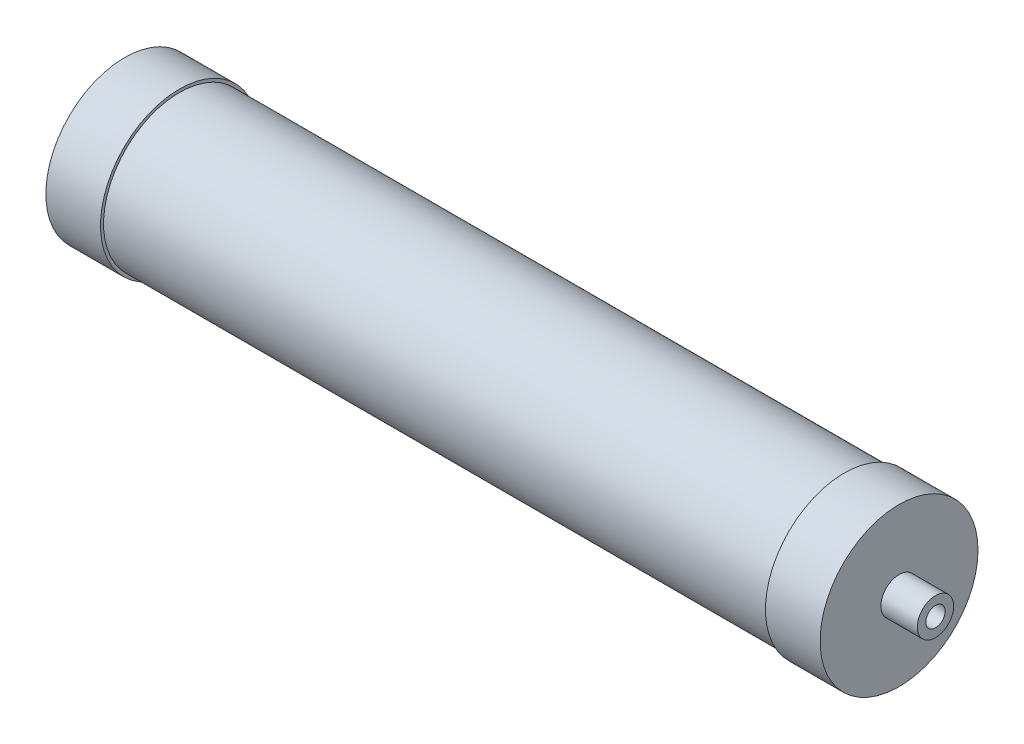
ISO-10303-21;
HEADER;
FILE_DESCRIPTION(('STEP AP214'),'2;1');
FILE_NAME('part.step','',(''),(''),'','','');
FILE_SCHEMA(('AUTOMOTIVE_DESIGN { 1 0 10303 214 1 1 1 1 }'));
ENDSEC;
DATA;
#1=APPLICATION_CONTEXT('core data for automotive mechanical design processes');
#2=APPLICATION_PROTOCOL_DEFINITION('international standard','automotive_design',2000,#1);
#3=PRODUCT_CONTEXT('',#1,'mechanical');
#4=PRODUCT('Part','Part','',(#3));
#5=PRODUCT_RELATED_PRODUCT_CATEGORY('part','',(#4));
#6=PRODUCT_DEFINITION_FORMATION('','',#4);
#7=PRODUCT_DEFINITION_CONTEXT('part definition',#1,'design');
#8=PRODUCT_DEFINITION('design','',#6,#7);
#9=PRODUCT_DEFINITION_SHAPE('','',#8);
#10=(LENGTH_UNIT() NAMED_UNIT(*) SI_UNIT(.MILLI.,.METRE.));
#11=(NAMED_UNIT(*) PLANE_ANGLE_UNIT() SI_UNIT($,.RADIAN.));
#12=(NAMED_UNIT(*) SI_UNIT($,.STERADIAN.) SOLID_ANGLE_UNIT());
#13=UNCERTAINTY_MEASURE_WITH_UNIT(LENGTH_MEASURE(1.E-05),#10,'distance_accuracy_value','');
#14=(GEOMETRIC_REPRESENTATION_CONTEXT(3) GLOBAL_UNCERTAINTY_ASSIGNED_CONTEXT((#13)) GLOBAL_UNIT_ASSIGNED_CONTEXT((#10,
#11,#12)) REPRESENTATION_CONTEXT('',''));
#15=CARTESIAN_POINT('',(0.,0.,0.));
#16=DIRECTION('',(0.,0.,1.));
#17=DIRECTION('',(1.,0.,0.));
#18=AXIS2_PLACEMENT_3D('',#15,#16,#17);
#19=CARTESIAN_POINT('',(127.5,0.,0.));
#20=DIRECTION('',(-1.,0.,0.));
#21=DIRECTION('',(0.,0.,1.));
#22=AXIS2_PLACEMENT_3D('',#19,#20,#21);
#23=CYLINDRICAL_SURFACE('',#22,25.);
#24=CARTESIAN_POINT('',(-109.5,0.,0.));
#25=DIRECTION('',(1.,0.,0.));
#26=DIRECTION('',(0.,0.,-1.));
#27=AXIS2_PLACEMENT_3D('',#24,#25,#26);
#28=CIRCLE('',#27,25.);
#29=CARTESIAN_POINT('',(-109.5,0.,-25.));
#30=VERTEX_POINT('',#29);
#31=EDGE_CURVE('E58',#30,#30,#28,.T.);
#32=ORIENTED_EDGE('',*,*,#31,.T.);
#33=EDGE_LOOP('',(#32));
#34=FACE_BOUND('',#33,.T.);
#35=CARTESIAN_POINT('',(109.5,0.,0.));
#36=DIRECTION('',(1.,0.,0.));
#37=DIRECTION('',(0.,0.,-1.));
#38=AXIS2_PLACEMENT_3D('',#35,#36,#37);
#39=CIRCLE('',#38,25.);
#40=CARTESIAN_POINT('',(109.5,0.,-25.));
#41=VERTEX_POINT('',#40);
#42=EDGE_CURVE('E49',#41,#41,#39,.T.);
#43=ORIENTED_EDGE('',*,*,#42,.F.);
#44=EDGE_LOOP('',(#43));
#45=FACE_BOUND('',#44,.T.);
#46=ADVANCED_FACE('F50',(#34,#45),#23,.T.);
#47=CARTESIAN_POINT('',(-109.5,0.,0.));
#48=DIRECTION('',(-1.,0.,0.));
#49=DIRECTION('',(0.,0.,1.));
#50=AXIS2_PLACEMENT_3D('',#47,#48,#49);
#51=CYLINDRICAL_SURFACE('',#50,26.);
#52=CARTESIAN_POINT('',(-109.5,0.,0.));
#53=DIRECTION('',(1.,0.,0.));
#54=DIRECTION('',(0.,0.,-1.));
#55=AXIS2_PLACEMENT_3D('',#52,#53,#54);
#56=CIRCLE('',#55,26.);
#57=CARTESIAN_POINT('',(-109.5,0.,-26.));
#58=VERTEX_POINT('',#57);
#59=EDGE_CURVE('E89',#58,#58,#56,.T.);
#60=ORIENTED_EDGE('',*,*,#59,.F.);
#61=EDGE_LOOP('',(#60));
#62=FACE_BOUND('',#61,.T.);
#63=CARTESIAN_POINT('',(-127.5,0.,0.));
#64=DIRECTION('',(1.,0.,0.));
#65=DIRECTION('',(0.,0.,-1.));
#66=AXIS2_PLACEMENT_3D('',#63,#64,#65);
#67=CIRCLE('',#66,26.);
#68=CARTESIAN_POINT('',(-127.5,0.,-26.));
#69=VERTEX_POINT('',#68);
#70=EDGE_CURVE('E88',#69,#69,#67,.T.);
#71=ORIENTED_EDGE('',*,*,#70,.T.);
#72=EDGE_LOOP('',(#71));
#73=FACE_BOUND('',#72,.T.);
#74=ADVANCED_FACE('F106',(#62,#73),#51,.T.);
#75=CARTESIAN_POINT('',(-109.5,0.,0.));
#76=DIRECTION('',(1.,0.,0.));
#77=DIRECTION('',(0.,0.,-1.));
#78=AXIS2_PLACEMENT_3D('',#75,#76,#77);
#79=PLANE('',#78);
#80=ORIENTED_EDGE('',*,*,#31,.F.);
#81=EDGE_LOOP('',(#80));
#82=FACE_BOUND('',#81,.T.);
#83=ORIENTED_EDGE('',*,*,#59,.T.);
#84=EDGE_LOOP('',(#83));
#85=FACE_BOUND('',#84,.T.);
#86=ADVANCED_FACE('F105',(#82,#85),#79,.T.);
#87=CARTESIAN_POINT('',(-127.5,0.,0.));
#88=DIRECTION('',(1.,0.,0.));
#89=DIRECTION('',(0.,0.,-1.));
#90=AXIS2_PLACEMENT_3D('',#87,#88,#89);
#91=PLANE('',#90);
#92=CARTESIAN_POINT('',(-127.5,0.,0.));
#93=DIRECTION('',(1.,0.,0.));
#94=DIRECTION('',(0.,0.,-1.));
#95=AXIS2_PLACEMENT_3D('',#92,#93,#94);
#96=CIRCLE('',#95,6.);
#97=CARTESIAN_POINT('',(-127.5,0.,-6.));
#98=VERTEX_POINT('',#97);
#99=EDGE_CURVE('E74',#98,#98,#96,.T.);
#100=ORIENTED_EDGE('',*,*,#99,.T.);
#101=EDGE_LOOP('',(#100));
#102=FACE_BOUND('',#101,.T.);
#103=ORIENTED_EDGE('',*,*,#70,.F.);
#104=EDGE_LOOP('',(#103));
#105=FACE_BOUND('',#104,.T.);
#106=ADVANCED_FACE('F104',(#102,#105),#91,.F.);
#107=CARTESIAN_POINT('',(127.5,0.,0.));
#108=DIRECTION('',(-1.,0.,0.));
#109=DIRECTION('',(0.,0.,1.));
#110=AXIS2_PLACEMENT_3D('',#107,#108,#109);
#111=CYLINDRICAL_SURFACE('',#110,26.);
#112=CARTESIAN_POINT('',(127.5,0.,0.));
#113=DIRECTION('',(1.,0.,0.));
#114=DIRECTION('',(0.,0.,-1.));
#115=AXIS2_PLACEMENT_3D('',#112,#113,#114);
#116=CIRCLE('',#115,26.);
#117=CARTESIAN_POINT('',(127.5,0.,-26.));
#118=VERTEX_POINT('',#117);
#119=EDGE_CURVE('E85',#118,#118,#116,.T.);
#120=ORIENTED_EDGE('',*,*,#119,.F.);
#121=EDGE_LOOP('',(#120));
#122=FACE_BOUND('',#121,.T.);
#123=CARTESIAN_POINT('',(109.5,0.,0.));
#124=DIRECTION('',(1.,0.,0.));
#125=DIRECTION('',(0.,0.,-1.));
#126=AXIS2_PLACEMENT_3D('',#123,#124,#125);
#127=CIRCLE('',#126,26.);
#128=CARTESIAN_POINT('',(109.5,0.,-26.));
#129=VERTEX_POINT('',#128);
#130=EDGE_CURVE('E79',#129,#129,#127,.T.);
#131=ORIENTED_EDGE('',*,*,#130,.T.);
#132=EDGE_LOOP('',(#131));
#133=FACE_BOUND('',#132,.T.);
#134=ADVANCED_FACE('F116',(#122,#133),#111,.T.);
#135=CARTESIAN_POINT('',(109.5,0.,0.));
#136=DIRECTION('',(1.,0.,0.));
#137=DIRECTION('',(0.,0.,-1.));
#138=AXIS2_PLACEMENT_3D('',#135,#136,#137);
#139=PLANE('',#138);
#140=ORIENTED_EDGE('',*,*,#42,.T.);
#141=EDGE_LOOP('',(#140));
#142=FACE_BOUND('',#141,.T.);
#143=ORIENTED_EDGE('',*,*,#130,.F.);
#144=EDGE_LOOP('',(#143));
#145=FACE_BOUND('',#144,.T.);
#146=ADVANCED_FACE('F123',(#142,#145),#139,.F.);
#147=CARTESIAN_POINT('',(127.5,0.,0.));
#148=DIRECTION('',(1.,0.,0.));
#149=DIRECTION('',(0.,0.,-1.));
#150=AXIS2_PLACEMENT_3D('',#147,#148,#149);
#151=PLANE('',#150);
#152=CARTESIAN_POINT('',(127.5,0.,0.));
#153=DIRECTION('',(1.,0.,0.));
#154=DIRECTION('',(0.,0.,-1.));
#155=AXIS2_PLACEMENT_3D('',#152,#153,#154);
#156=CIRCLE('',#155,6.);
#157=CARTESIAN_POINT('',(127.5,0.,-6.));
#158=VERTEX_POINT('',#157);
#159=EDGE_CURVE('E10',#158,#158,#156,.T.);
#160=ORIENTED_EDGE('',*,*,#159,.F.);
#161=EDGE_LOOP('',(#160));
#162=FACE_BOUND('',#161,.T.);
#163=ORIENTED_EDGE('',*,*,#119,.T.);
#164=EDGE_LOOP('',(#163));
#165=FACE_BOUND('',#164,.T.);
#166=ADVANCED_FACE('F147',(#162,#165),#151,.T.);
#167=CARTESIAN_POINT('',(-127.5,0.,0.));
#168=DIRECTION('',(-1.,0.,0.));
#169=DIRECTION('',(0.,0.,1.));
#170=AXIS2_PLACEMENT_3D('',#167,#168,#169);
#171=CYLINDRICAL_SURFACE('',#170,6.);
#172=ORIENTED_EDGE('',*,*,#99,.F.);
#173=EDGE_LOOP('',(#172));
#174=FACE_BOUND('',#173,.T.);
#175=CARTESIAN_POINT('',(-139.5,0.,0.));
#176=DIRECTION('',(1.,0.,0.));
#177=DIRECTION('',(0.,0.,-1.));
#178=AXIS2_PLACEMENT_3D('',#175,#176,#177);
#179=CIRCLE('',#178,6.);
#180=CARTESIAN_POINT('',(-139.5,0.,-6.));
#181=VERTEX_POINT('',#180);
#182=EDGE_CURVE('E69',#181,#181,#179,.T.);
#183=ORIENTED_EDGE('',*,*,#182,.T.);
#184=EDGE_LOOP('',(#183));
#185=FACE_BOUND('',#184,.T.);
#186=ADVANCED_FACE('F189',(#174,#185),#171,.T.);
#187=CARTESIAN_POINT('',(-139.5,0.,0.));
#188=DIRECTION('',(1.,0.,0.));
#189=DIRECTION('',(0.,0.,-1.));
#190=AXIS2_PLACEMENT_3D('',#187,#188,#189);
#191=PLANE('',#190);
#192=CARTESIAN_POINT('',(-139.5,0.,0.));
#193=DIRECTION('',(1.,0.,0.));
#194=DIRECTION('',(0.,0.,-1.));
#195=AXIS2_PLACEMENT_3D('',#192,#193,#194);
#196=CIRCLE('',#195,3.2);
#197=CARTESIAN_POINT('',(-139.5,0.,-3.2));
#198=VERTEX_POINT('',#197);
#199=EDGE_CURVE('E66',#198,#198,#196,.T.);
#200=ORIENTED_EDGE('',*,*,#199,.T.);
#201=EDGE_LOOP('',(#200));
#202=FACE_BOUND('',#201,.T.);
#203=ORIENTED_EDGE('',*,*,#182,.F.);
#204=EDGE_LOOP('',(#203));
#205=FACE_BOUND('',#204,.T.);
#206=ADVANCED_FACE('F203',(#202,#205),#191,.F.);
#207=CARTESIAN_POINT('',(-129.5,0.,0.));
#208=DIRECTION('',(-1.,0.,0.));
#209=DIRECTION('',(0.,0.,1.));
#210=AXIS2_PLACEMENT_3D('',#207,#208,#209);
#211=CYLINDRICAL_SURFACE('',#210,3.2);
#212=CARTESIAN_POINT('',(-129.5,0.,0.));
#213=DIRECTION('',(1.,0.,0.));
#214=DIRECTION('',(0.,0.,-1.));
#215=AXIS2_PLACEMENT_3D('',#212,#213,#214);
#216=CIRCLE('',#215,3.2);
#217=CARTESIAN_POINT('',(-129.5,0.,-3.2));
#218=VERTEX_POINT('',#217);
#219=EDGE_CURVE('E65',#218,#218,#216,.T.);
#220=ORIENTED_EDGE('',*,*,#219,.T.);
#221=EDGE_LOOP('',(#220));
#222=FACE_BOUND('',#221,.T.);
#223=ORIENTED_EDGE('',*,*,#199,.F.);
#224=EDGE_LOOP('',(#223));
#225=FACE_BOUND('',#224,.T.);
#226=ADVANCED_FACE('F211',(#222,#225),#211,.F.);
#227=CARTESIAN_POINT('',(-129.5,0.,0.));
#228=DIRECTION('',(1.,0.,0.));
#229=DIRECTION('',(0.,0.,-1.));
#230=AXIS2_PLACEMENT_3D('',#227,#228,#229);
#231=PLANE('',#230);
#232=ORIENTED_EDGE('',*,*,#219,.F.);
#233=EDGE_LOOP('',(#232));
#234=FACE_BOUND('',#233,.T.);
#235=ADVANCED_FACE('F222',(#234),#231,.F.);
#236=CARTESIAN_POINT('',(139.5,0.,0.));
#237=DIRECTION('',(-1.,0.,0.));
#238=DIRECTION('',(0.,0.,1.));
#239=AXIS2_PLACEMENT_3D('',#236,#237,#238);
#240=CYLINDRICAL_SURFACE('',#239,6.);
#241=CARTESIAN_POINT('',(139.5,0.,0.));
#242=DIRECTION('',(1.,0.,0.));
#243=DIRECTION('',(0.,0.,-1.));
#244=AXIS2_PLACEMENT_3D('',#241,#242,#243);
#245=CIRCLE('',#244,6.);
#246=CARTESIAN_POINT('',(139.5,0.,-6.));
#247=VERTEX_POINT('',#246);
#248=EDGE_CURVE('E64',#247,#247,#245,.T.);
#249=ORIENTED_EDGE('',*,*,#248,.F.);
#250=EDGE_LOOP('',(#249));
#251=FACE_BOUND('',#250,.T.);
#252=ORIENTED_EDGE('',*,*,#159,.T.);
#253=EDGE_LOOP('',(#252));
#254=FACE_BOUND('',#253,.T.);
#255=ADVANCED_FACE('F230',(#251,#254),#240,.T.);
#256=CARTESIAN_POINT('',(139.5,0.,0.));
#257=DIRECTION('',(1.,0.,0.));
#258=DIRECTION('',(0.,0.,-1.));
#259=AXIS2_PLACEMENT_3D('',#256,#257,#258);
#260=PLANE('',#259);
#261=CARTESIAN_POINT('',(139.5,0.,0.));
#262=DIRECTION('',(1.,0.,0.));
#263=DIRECTION('',(0.,0.,-1.));
#264=AXIS2_PLACEMENT_3D('',#261,#262,#263);
#265=CIRCLE('',#264,3.2);
#266=CARTESIAN_POINT('',(139.5,0.,-3.2));
#267=VERTEX_POINT('',#266);
#268=EDGE_CURVE('E277',#267,#267,#265,.T.);
#269=ORIENTED_EDGE('',*,*,#268,.F.);
#270=EDGE_LOOP('',(#269));
#271=FACE_BOUND('',#270,.T.);
#272=ORIENTED_EDGE('',*,*,#248,.T.);
#273=EDGE_LOOP('',(#272));
#274=FACE_BOUND('',#273,.T.);
#275=ADVANCED_FACE('F239',(#271,#274),#260,.T.);
#276=CARTESIAN_POINT('',(129.5,0.,0.));
#277=DIRECTION('',(1.,0.,0.));
#278=DIRECTION('',(0.,0.,-1.));
#279=AXIS2_PLACEMENT_3D('',#276,#277,#278);
#280=CYLINDRICAL_SURFACE('',#279,3.2);
#281=CARTESIAN_POINT('',(129.5,0.,0.));
#282=DIRECTION('',(1.,0.,0.));
#283=DIRECTION('',(0.,0.,-1.));
#284=AXIS2_PLACEMENT_3D('',#281,#282,#283);
#285=CIRCLE('',#284,3.2);
#286=CARTESIAN_POINT('',(129.5,0.,-3.2));
#287=VERTEX_POINT('',#286);
#288=EDGE_CURVE('E273',#287,#287,#285,.T.);
#289=ORIENTED_EDGE('',*,*,#288,.F.);
#290=EDGE_LOOP('',(#289));
#291=FACE_BOUND('',#290,.T.);
#292=ORIENTED_EDGE('',*,*,#268,.T.);
#293=EDGE_LOOP('',(#292));
#294=FACE_BOUND('',#293,.T.);
#295=ADVANCED_FACE('F249',(#291,#294),#280,.F.);
#296=CARTESIAN_POINT('',(129.5,0.,0.));
#297=DIRECTION('',(1.,0.,0.));
#298=DIRECTION('',(0.,0.,-1.));
#299=AXIS2_PLACEMENT_3D('',#296,#297,#298);
#300=PLANE('',#299);
#301=ORIENTED_EDGE('',*,*,#288,.T.);
#302=EDGE_LOOP('',(#301));
#303=FACE_BOUND('',#302,.T.);
#304=ADVANCED_FACE('F259',(#303),#300,.T.);
#305=CLOSED_SHELL('',(#46,#74,#86,#106,#134,#146,#166,#186,#206,#226,#235,#255,#275,#295,#304));
#306=MANIFOLD_SOLID_BREP('B2',#305);
#307=ADVANCED_BREP_SHAPE_REPRESENTATION('',(#18,#306),#14);
#308=SHAPE_DEFINITION_REPRESENTATION(#9,#307);
ENDSEC;
END-ISO-10303-21;
